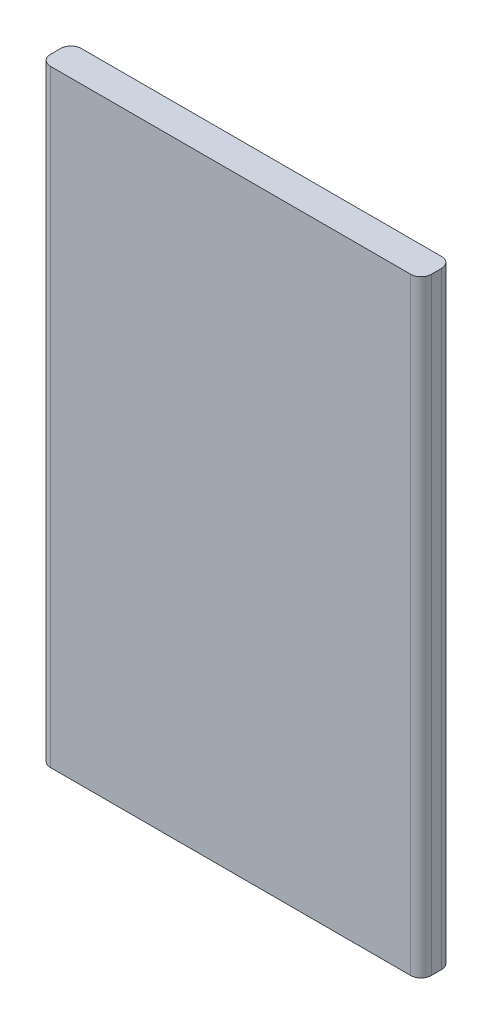
ISO-10303-21;
HEADER;
FILE_DESCRIPTION(('STEP AP214'),'2;1');
FILE_NAME('part.step','',(''),(''),'','','');
FILE_SCHEMA(('AUTOMOTIVE_DESIGN { 1 0 10303 214 1 1 1 1 }'));
ENDSEC;
DATA;
#1=APPLICATION_CONTEXT('core data for automotive mechanical design processes');
#2=APPLICATION_PROTOCOL_DEFINITION('international standard','automotive_design',2000,#1);
#3=PRODUCT_CONTEXT('',#1,'mechanical');
#4=PRODUCT('Part','Part','',(#3));
#5=PRODUCT_RELATED_PRODUCT_CATEGORY('part','',(#4));
#6=PRODUCT_DEFINITION_FORMATION('','',#4);
#7=PRODUCT_DEFINITION_CONTEXT('part definition',#1,'design');
#8=PRODUCT_DEFINITION('design','',#6,#7);
#9=PRODUCT_DEFINITION_SHAPE('','',#8);
#10=(LENGTH_UNIT() NAMED_UNIT(*) SI_UNIT(.MILLI.,.METRE.));
#11=(NAMED_UNIT(*) PLANE_ANGLE_UNIT() SI_UNIT($,.RADIAN.));
#12=(NAMED_UNIT(*) SI_UNIT($,.STERADIAN.) SOLID_ANGLE_UNIT());
#13=UNCERTAINTY_MEASURE_WITH_UNIT(LENGTH_MEASURE(1.E-05),#10,'distance_accuracy_value','');
#14=(GEOMETRIC_REPRESENTATION_CONTEXT(3) GLOBAL_UNCERTAINTY_ASSIGNED_CONTEXT((#13)) GLOBAL_UNIT_ASSIGNED_CONTEXT((#10,
#11,#12)) REPRESENTATION_CONTEXT('',''));
#15=CARTESIAN_POINT('',(0.,0.,0.));
#16=DIRECTION('',(0.,0.,1.));
#17=DIRECTION('',(1.,0.,0.));
#18=AXIS2_PLACEMENT_3D('',#15,#16,#17);
#19=CARTESIAN_POINT('',(18.5,-29.5,3.));
#20=DIRECTION('',(-1.,0.,0.));
#21=DIRECTION('',(0.,0.,1.));
#22=AXIS2_PLACEMENT_3D('',#19,#20,#21);
#23=PLANE('',#22);
#24=DIRECTION('',(0.,0.,-1.));
#25=VECTOR('',#24,1.);
#26=CARTESIAN_POINT('',(18.5,-29.5,3.));
#27=LINE('',#26,#25);
#28=CARTESIAN_POINT('',(18.5,-29.5,2.));
#29=VERTEX_POINT('',#28);
#30=CARTESIAN_POINT('',(18.5,-29.5,1.));
#31=VERTEX_POINT('',#30);
#32=EDGE_CURVE('E155',#29,#31,#27,.T.);
#33=ORIENTED_EDGE('',*,*,#32,.T.);
#34=DIRECTION('',(0.,1.,0.));
#35=VECTOR('',#34,1.);
#36=CARTESIAN_POINT('',(18.5,29.5,1.));
#37=LINE('',#36,#35);
#38=CARTESIAN_POINT('',(18.5,29.5,1.));
#39=VERTEX_POINT('',#38);
#40=EDGE_CURVE('E117',#31,#39,#37,.T.);
#41=ORIENTED_EDGE('',*,*,#40,.T.);
#42=DIRECTION('',(0.,0.,-1.));
#43=VECTOR('',#42,1.);
#44=CARTESIAN_POINT('',(18.5,29.5,3.));
#45=LINE('',#44,#43);
#46=CARTESIAN_POINT('',(18.5,29.5,2.));
#47=VERTEX_POINT('',#46);
#48=EDGE_CURVE('E109',#47,#39,#45,.T.);
#49=ORIENTED_EDGE('',*,*,#48,.F.);
#50=DIRECTION('',(0.,1.,0.));
#51=VECTOR('',#50,1.);
#52=CARTESIAN_POINT('',(18.5,-29.5,2.));
#53=LINE('',#52,#51);
#54=EDGE_CURVE('E122',#47,#29,#53,.F.);
#55=ORIENTED_EDGE('',*,*,#54,.T.);
#56=EDGE_LOOP('',(#33,#41,#49,#55));
#57=FACE_BOUND('',#56,.T.);
#58=ADVANCED_FACE('F39',(#57),#23,.F.);
#59=CARTESIAN_POINT('',(-18.5,29.5,3.));
#60=DIRECTION('',(0.,-1.,0.));
#61=DIRECTION('',(0.,0.,-1.));
#62=AXIS2_PLACEMENT_3D('',#59,#60,#61);
#63=PLANE('',#62);
#64=ORIENTED_EDGE('',*,*,#48,.T.);
#65=CARTESIAN_POINT('',(17.5,29.5,1.));
#66=DIRECTION('',(0.,-1.,0.));
#67=DIRECTION('',(0.,0.,-1.));
#68=AXIS2_PLACEMENT_3D('',#65,#66,#67);
#69=CIRCLE('',#68,1.);
#70=CARTESIAN_POINT('',(17.5,29.5,0.));
#71=VERTEX_POINT('',#70);
#72=EDGE_CURVE('E136',#39,#71,#69,.F.);
#73=ORIENTED_EDGE('',*,*,#72,.T.);
#74=DIRECTION('',(-1.,0.,0.));
#75=VECTOR('',#74,1.);
#76=CARTESIAN_POINT('',(-18.5,29.5,0.));
#77=LINE('',#76,#75);
#78=CARTESIAN_POINT('',(-17.5,29.5,0.));
#79=VERTEX_POINT('',#78);
#80=EDGE_CURVE('E162',#71,#79,#77,.T.);
#81=ORIENTED_EDGE('',*,*,#80,.T.);
#82=CARTESIAN_POINT('',(-17.5,29.5,1.));
#83=DIRECTION('',(0.,-1.,0.));
#84=DIRECTION('',(0.,0.,-1.));
#85=AXIS2_PLACEMENT_3D('',#82,#83,#84);
#86=CIRCLE('',#85,1.);
#87=CARTESIAN_POINT('',(-18.5,29.5,1.));
#88=VERTEX_POINT('',#87);
#89=EDGE_CURVE('E134',#79,#88,#86,.F.);
#90=ORIENTED_EDGE('',*,*,#89,.T.);
#91=DIRECTION('',(0.,0.,-1.));
#92=VECTOR('',#91,1.);
#93=CARTESIAN_POINT('',(-18.5,29.5,3.));
#94=LINE('',#93,#92);
#95=CARTESIAN_POINT('',(-18.5,29.5,2.));
#96=VERTEX_POINT('',#95);
#97=EDGE_CURVE('E125',#96,#88,#94,.T.);
#98=ORIENTED_EDGE('',*,*,#97,.F.);
#99=CARTESIAN_POINT('',(-17.5,29.5,2.));
#100=DIRECTION('',(0.,-1.,0.));
#101=DIRECTION('',(0.,0.,-1.));
#102=AXIS2_PLACEMENT_3D('',#99,#100,#101);
#103=CIRCLE('',#102,1.);
#104=CARTESIAN_POINT('',(-17.5,29.5,3.));
#105=VERTEX_POINT('',#104);
#106=EDGE_CURVE('E116',#96,#105,#103,.F.);
#107=ORIENTED_EDGE('',*,*,#106,.T.);
#108=DIRECTION('',(-1.,0.,0.));
#109=VECTOR('',#108,1.);
#110=CARTESIAN_POINT('',(-18.5,29.5,3.));
#111=LINE('',#110,#109);
#112=CARTESIAN_POINT('',(17.5,29.5,3.));
#113=VERTEX_POINT('',#112);
#114=EDGE_CURVE('E111',#113,#105,#111,.T.);
#115=ORIENTED_EDGE('',*,*,#114,.F.);
#116=CARTESIAN_POINT('',(17.5,29.5,2.));
#117=DIRECTION('',(0.,-1.,0.));
#118=DIRECTION('',(0.,0.,-1.));
#119=AXIS2_PLACEMENT_3D('',#116,#117,#118);
#120=CIRCLE('',#119,1.);
#121=EDGE_CURVE('E106',#113,#47,#120,.F.);
#122=ORIENTED_EDGE('',*,*,#121,.T.);
#123=EDGE_LOOP('',(#64,#73,#81,#90,#98,#107,#115,#122));
#124=FACE_BOUND('',#123,.T.);
#125=ADVANCED_FACE('F108',(#124),#63,.F.);
#126=CARTESIAN_POINT('',(-18.5,-29.5,3.));
#127=DIRECTION('',(1.,0.,0.));
#128=DIRECTION('',(0.,0.,-1.));
#129=AXIS2_PLACEMENT_3D('',#126,#127,#128);
#130=PLANE('',#129);
#131=ORIENTED_EDGE('',*,*,#97,.T.);
#132=DIRECTION('',(0.,-1.,0.));
#133=VECTOR('',#132,1.);
#134=CARTESIAN_POINT('',(-18.5,-29.5,1.));
#135=LINE('',#134,#133);
#136=CARTESIAN_POINT('',(-18.5,-29.5,1.));
#137=VERTEX_POINT('',#136);
#138=EDGE_CURVE('E149',#88,#137,#135,.T.);
#139=ORIENTED_EDGE('',*,*,#138,.T.);
#140=DIRECTION('',(0.,0.,-1.));
#141=VECTOR('',#140,1.);
#142=CARTESIAN_POINT('',(-18.5,-29.5,3.));
#143=LINE('',#142,#141);
#144=CARTESIAN_POINT('',(-18.5,-29.5,2.));
#145=VERTEX_POINT('',#144);
#146=EDGE_CURVE('E157',#145,#137,#143,.T.);
#147=ORIENTED_EDGE('',*,*,#146,.F.);
#148=DIRECTION('',(0.,-1.,0.));
#149=VECTOR('',#148,1.);
#150=CARTESIAN_POINT('',(-18.5,-29.5,2.));
#151=LINE('',#150,#149);
#152=EDGE_CURVE('E147',#145,#96,#151,.F.);
#153=ORIENTED_EDGE('',*,*,#152,.T.);
#154=EDGE_LOOP('',(#131,#139,#147,#153));
#155=FACE_BOUND('',#154,.T.);
#156=ADVANCED_FACE('F170',(#155),#130,.F.);
#157=CARTESIAN_POINT('',(-18.5,-29.5,3.));
#158=DIRECTION('',(0.,1.,0.));
#159=DIRECTION('',(0.,0.,1.));
#160=AXIS2_PLACEMENT_3D('',#157,#158,#159);
#161=PLANE('',#160);
#162=DIRECTION('',(1.,0.,0.));
#163=VECTOR('',#162,1.);
#164=CARTESIAN_POINT('',(-18.5,-29.5,0.));
#165=LINE('',#164,#163);
#166=CARTESIAN_POINT('',(-17.5,-29.5,0.));
#167=VERTEX_POINT('',#166);
#168=CARTESIAN_POINT('',(17.5,-29.5,0.));
#169=VERTEX_POINT('',#168);
#170=EDGE_CURVE('E159',#167,#169,#165,.T.);
#171=ORIENTED_EDGE('',*,*,#170,.T.);
#172=CARTESIAN_POINT('',(17.5,-29.5,1.));
#173=DIRECTION('',(0.,1.,0.));
#174=DIRECTION('',(0.,0.,1.));
#175=AXIS2_PLACEMENT_3D('',#172,#173,#174);
#176=CIRCLE('',#175,1.);
#177=EDGE_CURVE('E145',#169,#31,#176,.F.);
#178=ORIENTED_EDGE('',*,*,#177,.T.);
#179=ORIENTED_EDGE('',*,*,#32,.F.);
#180=CARTESIAN_POINT('',(17.5,-29.5,2.));
#181=DIRECTION('',(0.,1.,0.));
#182=DIRECTION('',(0.,0.,1.));
#183=AXIS2_PLACEMENT_3D('',#180,#181,#182);
#184=CIRCLE('',#183,1.);
#185=CARTESIAN_POINT('',(17.5,-29.5,3.));
#186=VERTEX_POINT('',#185);
#187=EDGE_CURVE('E128',#29,#186,#184,.F.);
#188=ORIENTED_EDGE('',*,*,#187,.T.);
#189=DIRECTION('',(1.,0.,0.));
#190=VECTOR('',#189,1.);
#191=CARTESIAN_POINT('',(-18.5,-29.5,3.));
#192=LINE('',#191,#190);
#193=CARTESIAN_POINT('',(-17.5,-29.5,3.));
#194=VERTEX_POINT('',#193);
#195=EDGE_CURVE('E154',#194,#186,#192,.T.);
#196=ORIENTED_EDGE('',*,*,#195,.F.);
#197=CARTESIAN_POINT('',(-17.5,-29.5,2.));
#198=DIRECTION('',(0.,1.,0.));
#199=DIRECTION('',(0.,0.,1.));
#200=AXIS2_PLACEMENT_3D('',#197,#198,#199);
#201=CIRCLE('',#200,1.);
#202=EDGE_CURVE('E62',#194,#145,#201,.F.);
#203=ORIENTED_EDGE('',*,*,#202,.T.);
#204=ORIENTED_EDGE('',*,*,#146,.T.);
#205=CARTESIAN_POINT('',(-17.5,-29.5,1.));
#206=DIRECTION('',(0.,1.,0.));
#207=DIRECTION('',(0.,0.,1.));
#208=AXIS2_PLACEMENT_3D('',#205,#206,#207);
#209=CIRCLE('',#208,1.);
#210=EDGE_CURVE('E54',#137,#167,#209,.F.);
#211=ORIENTED_EDGE('',*,*,#210,.T.);
#212=EDGE_LOOP('',(#171,#178,#179,#188,#196,#203,#204,#211));
#213=FACE_BOUND('',#212,.T.);
#214=ADVANCED_FACE('F183',(#213),#161,.F.);
#215=CARTESIAN_POINT('',(0.,0.,3.));
#216=DIRECTION('',(0.,0.,-1.));
#217=DIRECTION('',(-1.,0.,0.));
#218=AXIS2_PLACEMENT_3D('',#215,#216,#217);
#219=PLANE('',#218);
#220=ORIENTED_EDGE('',*,*,#114,.T.);
#221=DIRECTION('',(0.,-1.,0.));
#222=VECTOR('',#221,1.);
#223=CARTESIAN_POINT('',(-17.5,0.,3.));
#224=LINE('',#223,#222);
#225=EDGE_CURVE('E11',#105,#194,#224,.T.);
#226=ORIENTED_EDGE('',*,*,#225,.T.);
#227=ORIENTED_EDGE('',*,*,#195,.T.);
#228=DIRECTION('',(0.,1.,0.));
#229=VECTOR('',#228,1.);
#230=CARTESIAN_POINT('',(17.5,0.,3.));
#231=LINE('',#230,#229);
#232=EDGE_CURVE('E47',#186,#113,#231,.T.);
#233=ORIENTED_EDGE('',*,*,#232,.T.);
#234=EDGE_LOOP('',(#220,#226,#227,#233));
#235=FACE_BOUND('',#234,.T.);
#236=ADVANCED_FACE('F152',(#235),#219,.F.);
#237=CARTESIAN_POINT('',(0.,0.,0.));
#238=DIRECTION('',(0.,0.,-1.));
#239=DIRECTION('',(-1.,0.,0.));
#240=AXIS2_PLACEMENT_3D('',#237,#238,#239);
#241=PLANE('',#240);
#242=ORIENTED_EDGE('',*,*,#80,.F.);
#243=DIRECTION('',(0.,1.,0.));
#244=VECTOR('',#243,1.);
#245=CARTESIAN_POINT('',(17.5,-29.5,0.));
#246=LINE('',#245,#244);
#247=EDGE_CURVE('E140',#71,#169,#246,.F.);
#248=ORIENTED_EDGE('',*,*,#247,.T.);
#249=ORIENTED_EDGE('',*,*,#170,.F.);
#250=DIRECTION('',(0.,-1.,0.));
#251=VECTOR('',#250,1.);
#252=CARTESIAN_POINT('',(-17.5,29.5,0.));
#253=LINE('',#252,#251);
#254=EDGE_CURVE('E138',#167,#79,#253,.F.);
#255=ORIENTED_EDGE('',*,*,#254,.T.);
#256=EDGE_LOOP('',(#242,#248,#249,#255));
#257=FACE_BOUND('',#256,.T.);
#258=ADVANCED_FACE('F178',(#257),#241,.T.);
#259=CARTESIAN_POINT('',(17.5,-29.5,1.));
#260=DIRECTION('',(0.,-1.,0.));
#261=DIRECTION('',(0.,0.,-1.));
#262=AXIS2_PLACEMENT_3D('',#259,#260,#261);
#263=CYLINDRICAL_SURFACE('',#262,1.);
#264=ORIENTED_EDGE('',*,*,#177,.F.);
#265=ORIENTED_EDGE('',*,*,#247,.F.);
#266=ORIENTED_EDGE('',*,*,#72,.F.);
#267=ORIENTED_EDGE('',*,*,#40,.F.);
#268=EDGE_LOOP('',(#264,#265,#266,#267));
#269=FACE_BOUND('',#268,.T.);
#270=ADVANCED_FACE('F182',(#269),#263,.T.);
#271=CARTESIAN_POINT('',(-17.5,-29.5,1.));
#272=DIRECTION('',(0.,1.,0.));
#273=DIRECTION('',(0.,0.,1.));
#274=AXIS2_PLACEMENT_3D('',#271,#272,#273);
#275=CYLINDRICAL_SURFACE('',#274,1.);
#276=ORIENTED_EDGE('',*,*,#89,.F.);
#277=ORIENTED_EDGE('',*,*,#254,.F.);
#278=ORIENTED_EDGE('',*,*,#210,.F.);
#279=ORIENTED_EDGE('',*,*,#138,.F.);
#280=EDGE_LOOP('',(#276,#277,#278,#279));
#281=FACE_BOUND('',#280,.T.);
#282=ADVANCED_FACE('F174',(#281),#275,.T.);
#283=CARTESIAN_POINT('',(-17.5,0.,2.));
#284=DIRECTION('',(0.,-1.,0.));
#285=DIRECTION('',(0.,0.,-1.));
#286=AXIS2_PLACEMENT_3D('',#283,#284,#285);
#287=CYLINDRICAL_SURFACE('',#286,1.);
#288=ORIENTED_EDGE('',*,*,#106,.F.);
#289=ORIENTED_EDGE('',*,*,#152,.F.);
#290=ORIENTED_EDGE('',*,*,#202,.F.);
#291=ORIENTED_EDGE('',*,*,#225,.F.);
#292=EDGE_LOOP('',(#288,#289,#290,#291));
#293=FACE_BOUND('',#292,.T.);
#294=ADVANCED_FACE('F185',(#293),#287,.T.);
#295=CARTESIAN_POINT('',(17.5,0.,2.));
#296=DIRECTION('',(0.,1.,0.));
#297=DIRECTION('',(0.,0.,1.));
#298=AXIS2_PLACEMENT_3D('',#295,#296,#297);
#299=CYLINDRICAL_SURFACE('',#298,1.);
#300=ORIENTED_EDGE('',*,*,#187,.F.);
#301=ORIENTED_EDGE('',*,*,#54,.F.);
#302=ORIENTED_EDGE('',*,*,#121,.F.);
#303=ORIENTED_EDGE('',*,*,#232,.F.);
#304=EDGE_LOOP('',(#300,#301,#302,#303));
#305=FACE_BOUND('',#304,.T.);
#306=ADVANCED_FACE('F41',(#305),#299,.T.);
#307=CLOSED_SHELL('',(#58,#125,#156,#214,#236,#258,#270,#282,#294,#306));
#308=MANIFOLD_SOLID_BREP('B2',#307);
#309=ADVANCED_BREP_SHAPE_REPRESENTATION('',(#18,#308),#14);
#310=SHAPE_DEFINITION_REPRESENTATION(#9,#309);
ENDSEC;
END-ISO-10303-21;
